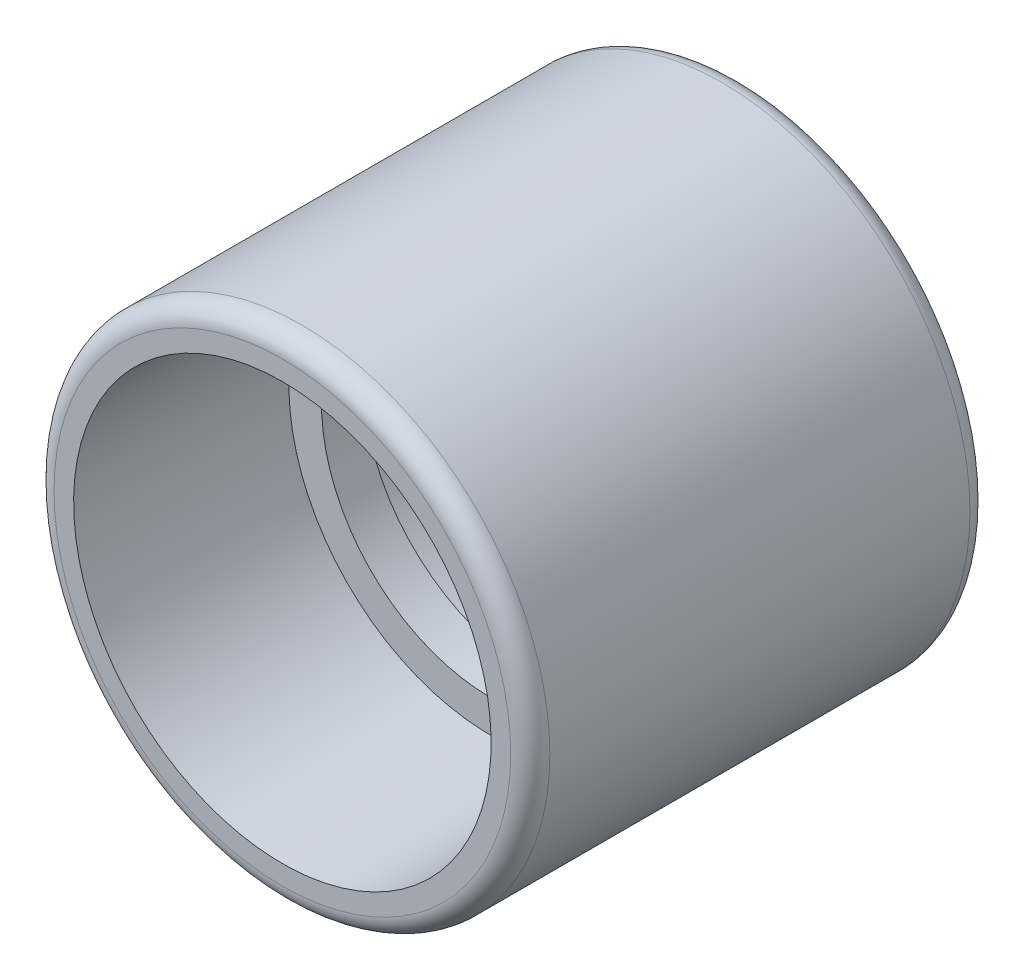
ISO-10303-21;
HEADER;
FILE_DESCRIPTION(('STEP AP214'),'2;1');
FILE_NAME('part.step','',(''),(''),'','','');
FILE_SCHEMA(('AUTOMOTIVE_DESIGN { 1 0 10303 214 1 1 1 1 }'));
ENDSEC;
DATA;
#1=APPLICATION_CONTEXT('core data for automotive mechanical design processes');
#2=APPLICATION_PROTOCOL_DEFINITION('international standard','automotive_design',2000,#1);
#3=PRODUCT_CONTEXT('',#1,'mechanical');
#4=PRODUCT('Part','Part','',(#3));
#5=PRODUCT_RELATED_PRODUCT_CATEGORY('part','',(#4));
#6=PRODUCT_DEFINITION_FORMATION('','',#4);
#7=PRODUCT_DEFINITION_CONTEXT('part definition',#1,'design');
#8=PRODUCT_DEFINITION('design','',#6,#7);
#9=PRODUCT_DEFINITION_SHAPE('','',#8);
#10=(LENGTH_UNIT() NAMED_UNIT(*) SI_UNIT(.MILLI.,.METRE.));
#11=(NAMED_UNIT(*) PLANE_ANGLE_UNIT() SI_UNIT($,.RADIAN.));
#12=(NAMED_UNIT(*) SI_UNIT($,.STERADIAN.) SOLID_ANGLE_UNIT());
#13=UNCERTAINTY_MEASURE_WITH_UNIT(LENGTH_MEASURE(1.E-05),#10,'distance_accuracy_value','');
#14=(GEOMETRIC_REPRESENTATION_CONTEXT(3) GLOBAL_UNCERTAINTY_ASSIGNED_CONTEXT((#13)) GLOBAL_UNIT_ASSIGNED_CONTEXT((#10,
#11,#12)) REPRESENTATION_CONTEXT('',''));
#15=CARTESIAN_POINT('',(0.,0.,0.));
#16=DIRECTION('',(0.,0.,1.));
#17=DIRECTION('',(1.,0.,0.));
#18=AXIS2_PLACEMENT_3D('',#15,#16,#17);
#19=CARTESIAN_POINT('',(0.,0.,8.8));
#20=DIRECTION('',(0.,0.,1.));
#21=DIRECTION('',(1.,0.,0.));
#22=AXIS2_PLACEMENT_3D('',#19,#20,#21);
#23=PLANE('',#22);
#24=CARTESIAN_POINT('',(0.,0.,8.8));
#25=DIRECTION('',(0.,0.,1.));
#26=DIRECTION('',(1.,0.,0.));
#27=AXIS2_PLACEMENT_3D('',#24,#25,#26);
#28=CIRCLE('',#27,8.75);
#29=CARTESIAN_POINT('',(8.75,0.,8.8));
#30=VERTEX_POINT('',#29);
#31=EDGE_CURVE('E47',#30,#30,#28,.T.);
#32=ORIENTED_EDGE('',*,*,#31,.T.);
#33=EDGE_LOOP('',(#32));
#34=FACE_BOUND('',#33,.T.);
#35=CARTESIAN_POINT('',(0.,0.,8.8));
#36=DIRECTION('',(0.,0.,-1.));
#37=DIRECTION('',(0.,1.,0.));
#38=AXIS2_PLACEMENT_3D('',#35,#36,#37);
#39=CIRCLE('',#38,8.);
#40=CARTESIAN_POINT('',(0.,8.,8.8));
#41=VERTEX_POINT('',#40);
#42=EDGE_CURVE('E53',#41,#41,#39,.T.);
#43=ORIENTED_EDGE('',*,*,#42,.T.);
#44=EDGE_LOOP('',(#43));
#45=FACE_BOUND('',#44,.T.);
#46=ADVANCED_FACE('F30',(#34,#45),#23,.T.);
#47=CARTESIAN_POINT('',(0.,0.,-8.8));
#48=DIRECTION('',(0.,0.,1.));
#49=DIRECTION('',(1.,0.,0.));
#50=AXIS2_PLACEMENT_3D('',#47,#48,#49);
#51=PLANE('',#50);
#52=CARTESIAN_POINT('',(0.,0.,-8.8));
#53=DIRECTION('',(0.,0.,-1.));
#54=DIRECTION('',(0.,1.,0.));
#55=AXIS2_PLACEMENT_3D('',#52,#53,#54);
#56=CIRCLE('',#55,8.);
#57=CARTESIAN_POINT('',(0.,8.,-8.8));
#58=VERTEX_POINT('',#57);
#59=EDGE_CURVE('E59',#58,#58,#56,.T.);
#60=ORIENTED_EDGE('',*,*,#59,.F.);
#61=EDGE_LOOP('',(#60));
#62=FACE_BOUND('',#61,.T.);
#63=CARTESIAN_POINT('',(0.,0.,-8.8));
#64=DIRECTION('',(0.,0.,1.));
#65=DIRECTION('',(1.,0.,0.));
#66=AXIS2_PLACEMENT_3D('',#63,#64,#65);
#67=CIRCLE('',#66,8.75);
#68=CARTESIAN_POINT('',(8.75,0.,-8.8));
#69=VERTEX_POINT('',#68);
#70=EDGE_CURVE('E10',#69,#69,#67,.F.);
#71=ORIENTED_EDGE('',*,*,#70,.T.);
#72=EDGE_LOOP('',(#71));
#73=FACE_BOUND('',#72,.T.);
#74=ADVANCED_FACE('F82',(#62,#73),#51,.F.);
#75=CARTESIAN_POINT('',(0.,0.,8.8));
#76=DIRECTION('',(0.,0.,-1.));
#77=DIRECTION('',(-1.,0.,0.));
#78=AXIS2_PLACEMENT_3D('',#75,#76,#77);
#79=CYLINDRICAL_SURFACE('',#78,9.5);
#80=CARTESIAN_POINT('',(0.,0.,8.05));
#81=DIRECTION('',(0.,0.,1.));
#82=DIRECTION('',(1.,0.,0.));
#83=AXIS2_PLACEMENT_3D('',#80,#81,#82);
#84=CIRCLE('',#83,9.5);
#85=CARTESIAN_POINT('',(9.5,0.,8.05));
#86=VERTEX_POINT('',#85);
#87=EDGE_CURVE('E38',#86,#86,#84,.F.);
#88=ORIENTED_EDGE('',*,*,#87,.T.);
#89=EDGE_LOOP('',(#88));
#90=FACE_BOUND('',#89,.T.);
#91=CARTESIAN_POINT('',(0.,0.,-8.05));
#92=DIRECTION('',(0.,0.,1.));
#93=DIRECTION('',(1.,0.,0.));
#94=AXIS2_PLACEMENT_3D('',#91,#92,#93);
#95=CIRCLE('',#94,9.5);
#96=CARTESIAN_POINT('',(9.5,0.,-8.05));
#97=VERTEX_POINT('',#96);
#98=EDGE_CURVE('E42',#97,#97,#95,.T.);
#99=ORIENTED_EDGE('',*,*,#98,.T.);
#100=EDGE_LOOP('',(#99));
#101=FACE_BOUND('',#100,.T.);
#102=ADVANCED_FACE('F88',(#90,#101),#79,.T.);
#103=CARTESIAN_POINT('',(0.,0.,27.1847763108502));
#104=DIRECTION('',(0.,0.,-1.));
#105=DIRECTION('',(-1.,0.,0.));
#106=AXIS2_PLACEMENT_3D('',#103,#104,#105);
#107=CYLINDRICAL_SURFACE('',#106,6.5);
#108=CARTESIAN_POINT('',(0.,0.,-0.799999999999995));
#109=DIRECTION('',(0.,0.,1.));
#110=DIRECTION('',(0.,-1.,0.));
#111=AXIS2_PLACEMENT_3D('',#108,#109,#110);
#112=CIRCLE('',#111,6.5);
#113=CARTESIAN_POINT('',(0.,-6.5,-0.799999999999995));
#114=VERTEX_POINT('',#113);
#115=EDGE_CURVE('E34',#114,#114,#112,.T.);
#116=ORIENTED_EDGE('',*,*,#115,.F.);
#117=EDGE_LOOP('',(#116));
#118=FACE_BOUND('',#117,.T.);
#119=CARTESIAN_POINT('',(0.,0.,0.799999999999995));
#120=DIRECTION('',(0.,0.,-1.));
#121=DIRECTION('',(0.,1.,0.));
#122=AXIS2_PLACEMENT_3D('',#119,#120,#121);
#123=CIRCLE('',#122,6.5);
#124=CARTESIAN_POINT('',(0.,6.5,0.799999999999995));
#125=VERTEX_POINT('',#124);
#126=EDGE_CURVE('E50',#125,#125,#123,.T.);
#127=ORIENTED_EDGE('',*,*,#126,.F.);
#128=EDGE_LOOP('',(#127));
#129=FACE_BOUND('',#128,.T.);
#130=ADVANCED_FACE('F93',(#118,#129),#107,.F.);
#131=CARTESIAN_POINT('',(0.,0.,0.799999999999996));
#132=DIRECTION('',(0.,0.,1.));
#133=DIRECTION('',(0.,-1.,0.));
#134=AXIS2_PLACEMENT_3D('',#131,#132,#133);
#135=CONICAL_SURFACE('',#134,7.75091925436745,0.0311250383272246);
#136=ORIENTED_EDGE('',*,*,#42,.F.);
#137=EDGE_LOOP('',(#136));
#138=FACE_BOUND('',#137,.T.);
#139=CARTESIAN_POINT('',(0.,0.,0.799999999999996));
#140=DIRECTION('',(0.,0.,-1.));
#141=DIRECTION('',(0.,1.,0.));
#142=AXIS2_PLACEMENT_3D('',#139,#140,#141);
#143=CIRCLE('',#142,7.75091925436745);
#144=CARTESIAN_POINT('',(0.,7.75091925436745,0.799999999999996));
#145=VERTEX_POINT('',#144);
#146=EDGE_CURVE('E56',#145,#145,#143,.T.);
#147=ORIENTED_EDGE('',*,*,#146,.T.);
#148=EDGE_LOOP('',(#147));
#149=FACE_BOUND('',#148,.T.);
#150=ADVANCED_FACE('F104',(#138,#149),#135,.F.);
#151=CARTESIAN_POINT('',(0.,0.,0.799999999999995));
#152=DIRECTION('',(0.,0.,-1.));
#153=DIRECTION('',(0.,1.,0.));
#154=AXIS2_PLACEMENT_3D('',#151,#152,#153);
#155=PLANE('',#154);
#156=ORIENTED_EDGE('',*,*,#126,.T.);
#157=EDGE_LOOP('',(#156));
#158=FACE_BOUND('',#157,.T.);
#159=ORIENTED_EDGE('',*,*,#146,.F.);
#160=EDGE_LOOP('',(#159));
#161=FACE_BOUND('',#160,.T.);
#162=ADVANCED_FACE('F99',(#158,#161),#155,.F.);
#163=CARTESIAN_POINT('',(0.,0.,8.05));
#164=DIRECTION('',(0.,0.,1.));
#165=DIRECTION('',(1.,0.,0.));
#166=AXIS2_PLACEMENT_3D('',#163,#164,#165);
#167=TOROIDAL_SURFACE('',#166,8.75,0.75);
#168=ORIENTED_EDGE('',*,*,#87,.F.);
#169=EDGE_LOOP('',(#168));
#170=FACE_BOUND('',#169,.T.);
#171=ORIENTED_EDGE('',*,*,#31,.F.);
#172=EDGE_LOOP('',(#171));
#173=FACE_BOUND('',#172,.T.);
#174=ADVANCED_FACE('F78',(#170,#173),#167,.T.);
#175=CARTESIAN_POINT('',(0.,0.,-8.05));
#176=DIRECTION('',(0.,0.,1.));
#177=DIRECTION('',(1.,0.,0.));
#178=AXIS2_PLACEMENT_3D('',#175,#176,#177);
#179=TOROIDAL_SURFACE('',#178,8.75,0.75);
#180=ORIENTED_EDGE('',*,*,#70,.F.);
#181=EDGE_LOOP('',(#180));
#182=FACE_BOUND('',#181,.T.);
#183=ORIENTED_EDGE('',*,*,#98,.F.);
#184=EDGE_LOOP('',(#183));
#185=FACE_BOUND('',#184,.T.);
#186=ADVANCED_FACE('F32',(#182,#185),#179,.T.);
#187=CARTESIAN_POINT('',(0.,0.,-0.799999999999996));
#188=DIRECTION('',(0.,0.,-1.));
#189=DIRECTION('',(0.,-1.,0.));
#190=AXIS2_PLACEMENT_3D('',#187,#188,#189);
#191=CONICAL_SURFACE('',#190,7.75091925436745,0.0311250383272246);
#192=ORIENTED_EDGE('',*,*,#59,.T.);
#193=EDGE_LOOP('',(#192));
#194=FACE_BOUND('',#193,.T.);
#195=CARTESIAN_POINT('',(0.,0.,-0.799999999999996));
#196=DIRECTION('',(0.,0.,-1.));
#197=DIRECTION('',(0.,1.,0.));
#198=AXIS2_PLACEMENT_3D('',#195,#196,#197);
#199=CIRCLE('',#198,7.75091925436745);
#200=CARTESIAN_POINT('',(0.,7.75091925436745,-0.799999999999996));
#201=VERTEX_POINT('',#200);
#202=EDGE_CURVE('E62',#201,#201,#199,.T.);
#203=ORIENTED_EDGE('',*,*,#202,.F.);
#204=EDGE_LOOP('',(#203));
#205=FACE_BOUND('',#204,.T.);
#206=ADVANCED_FACE('F68',(#194,#205),#191,.F.);
#207=CARTESIAN_POINT('',(0.,0.,-0.799999999999995));
#208=DIRECTION('',(0.,0.,1.));
#209=DIRECTION('',(0.,1.,0.));
#210=AXIS2_PLACEMENT_3D('',#207,#208,#209);
#211=PLANE('',#210);
#212=ORIENTED_EDGE('',*,*,#115,.T.);
#213=EDGE_LOOP('',(#212));
#214=FACE_BOUND('',#213,.T.);
#215=ORIENTED_EDGE('',*,*,#202,.T.);
#216=EDGE_LOOP('',(#215));
#217=FACE_BOUND('',#216,.T.);
#218=ADVANCED_FACE('F66',(#214,#217),#211,.F.);
#219=CLOSED_SHELL('',(#46,#74,#102,#130,#150,#162,#174,#186,#206,#218));
#220=MANIFOLD_SOLID_BREP('B2',#219);
#221=ADVANCED_BREP_SHAPE_REPRESENTATION('',(#18,#220),#14);
#222=SHAPE_DEFINITION_REPRESENTATION(#9,#221);
ENDSEC;
END-ISO-10303-21;
